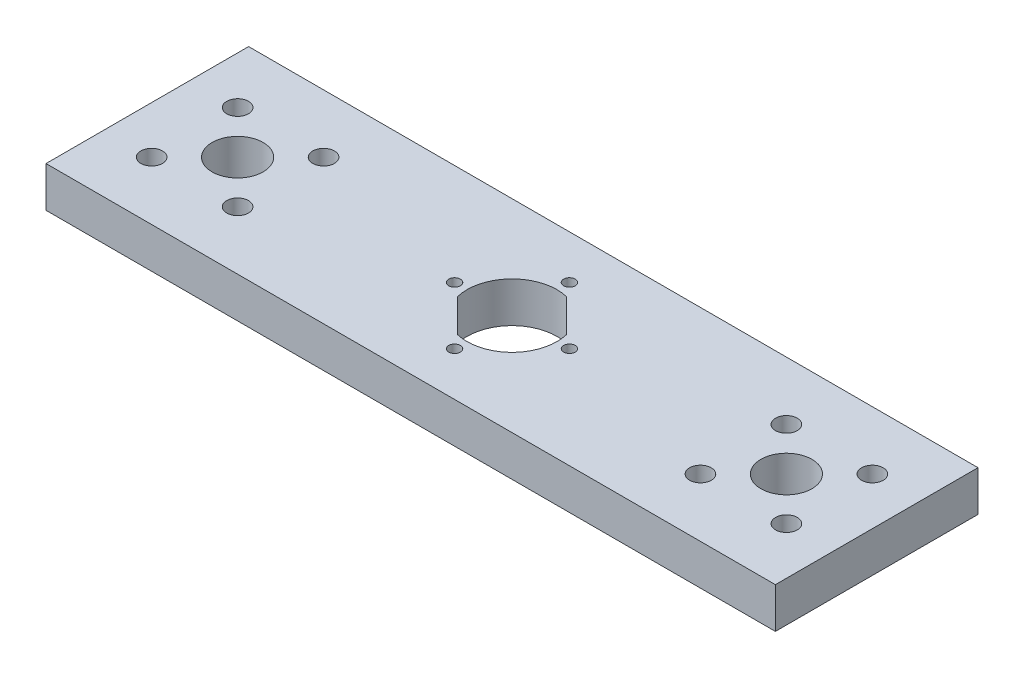
ISO-10303-21;
HEADER;
FILE_DESCRIPTION(('STEP AP214'),'2;1');
FILE_NAME('part.step','',(''),(''),'','','');
FILE_SCHEMA(('AUTOMOTIVE_DESIGN { 1 0 10303 214 1 1 1 1 }'));
ENDSEC;
DATA;
#1=APPLICATION_CONTEXT('core data for automotive mechanical design processes');
#2=APPLICATION_PROTOCOL_DEFINITION('international standard','automotive_design',2000,#1);
#3=PRODUCT_CONTEXT('',#1,'mechanical');
#4=PRODUCT('Part','Part','',(#3));
#5=PRODUCT_RELATED_PRODUCT_CATEGORY('part','',(#4));
#6=PRODUCT_DEFINITION_FORMATION('','',#4);
#7=PRODUCT_DEFINITION_CONTEXT('part definition',#1,'design');
#8=PRODUCT_DEFINITION('design','',#6,#7);
#9=PRODUCT_DEFINITION_SHAPE('','',#8);
#10=(LENGTH_UNIT() NAMED_UNIT(*) SI_UNIT(.MILLI.,.METRE.));
#11=(NAMED_UNIT(*) PLANE_ANGLE_UNIT() SI_UNIT($,.RADIAN.));
#12=(NAMED_UNIT(*) SI_UNIT($,.STERADIAN.) SOLID_ANGLE_UNIT());
#13=UNCERTAINTY_MEASURE_WITH_UNIT(LENGTH_MEASURE(1.E-05),#10,'distance_accuracy_value','');
#14=(GEOMETRIC_REPRESENTATION_CONTEXT(3) GLOBAL_UNCERTAINTY_ASSIGNED_CONTEXT((#13)) GLOBAL_UNIT_ASSIGNED_CONTEXT((#10,
#11,#12)) REPRESENTATION_CONTEXT('',''));
#15=CARTESIAN_POINT('',(0.,0.,0.));
#16=DIRECTION('',(0.,0.,1.));
#17=DIRECTION('',(1.,0.,0.));
#18=AXIS2_PLACEMENT_3D('',#15,#16,#17);
#19=CARTESIAN_POINT('',(6.65649530361137,6.35,-1.6166540362697));
#20=DIRECTION('',(0.,-1.,0.));
#21=DIRECTION('',(0.,0.,-1.));
#22=AXIS2_PLACEMENT_3D('',#19,#20,#21);
#23=CYLINDRICAL_SURFACE('',#22,0.200000000000003);
#24=CARTESIAN_POINT('',(6.65649530361137,0.,-1.6166540362697));
#25=DIRECTION('',(0.,1.,0.));
#26=DIRECTION('',(0.,0.,1.));
#27=AXIS2_PLACEMENT_3D('',#24,#25,#26);
#28=CIRCLE('',#27,0.200000000000003);
#29=CARTESIAN_POINT('',(6.85084553145407,0.,-1.66385561397103));
#30=VERTEX_POINT('',#29);
#31=CARTESIAN_POINT('',(6.79791665984869,0.,-1.75807539250701));
#32=VERTEX_POINT('',#31);
#33=EDGE_CURVE('E224',#30,#32,#28,.T.);
#34=ORIENTED_EDGE('',*,*,#33,.F.);
#35=DIRECTION('',(0.,-1.,0.));
#36=VECTOR('',#35,1.);
#37=CARTESIAN_POINT('',(6.85084553145407,6.35,-1.66385561397103));
#38=LINE('',#37,#36);
#39=CARTESIAN_POINT('',(6.85084553145407,6.35,-1.66385561397103));
#40=VERTEX_POINT('',#39);
#41=EDGE_CURVE('E11',#40,#30,#38,.T.);
#42=ORIENTED_EDGE('',*,*,#41,.F.);
#43=CARTESIAN_POINT('',(6.65649530361137,6.35,-1.6166540362697));
#44=DIRECTION('',(0.,1.,0.));
#45=DIRECTION('',(0.,0.,1.));
#46=AXIS2_PLACEMENT_3D('',#43,#44,#45);
#47=CIRCLE('',#46,0.200000000000003);
#48=CARTESIAN_POINT('',(6.79791665984869,6.35,-1.75807539250701));
#49=VERTEX_POINT('',#48);
#50=EDGE_CURVE('E424',#40,#49,#47,.T.);
#51=ORIENTED_EDGE('',*,*,#50,.T.);
#52=DIRECTION('',(0.,-1.,0.));
#53=VECTOR('',#52,1.);
#54=CARTESIAN_POINT('',(6.79791665984869,6.35,-1.75807539250701));
#55=LINE('',#54,#53);
#56=EDGE_CURVE('E62',#49,#32,#55,.T.);
#57=ORIENTED_EDGE('',*,*,#56,.T.);
#58=EDGE_LOOP('',(#34,#42,#51,#57));
#59=FACE_BOUND('',#58,.T.);
#60=ADVANCED_FACE('F43',(#59),#23,.F.);
#61=CARTESIAN_POINT('',(-7.54442081724038E-13,6.35,7.70217223333702E-13));
#62=DIRECTION('',(0.,-1.,0.));
#63=DIRECTION('',(0.,0.,-1.));
#64=AXIS2_PLACEMENT_3D('',#61,#62,#63);
#65=CYLINDRICAL_SURFACE('',#64,7.05);
#66=CARTESIAN_POINT('',(-7.54442081724038E-13,0.,7.70217223333702E-13));
#67=DIRECTION('',(0.,1.,0.));
#68=DIRECTION('',(0.,0.,1.));
#69=AXIS2_PLACEMENT_3D('',#66,#67,#68);
#70=CIRCLE('',#69,7.05);
#71=CARTESIAN_POINT('',(-1.66385561397255,0.,6.85084553145559));
#72=VERTEX_POINT('',#71);
#73=EDGE_CURVE('E226',#72,#30,#70,.T.);
#74=ORIENTED_EDGE('',*,*,#73,.F.);
#75=DIRECTION('',(0.,-1.,0.));
#76=VECTOR('',#75,1.);
#77=CARTESIAN_POINT('',(-1.66385561397255,6.35,6.85084553145559));
#78=LINE('',#77,#76);
#79=CARTESIAN_POINT('',(-1.66385561397255,6.35,6.85084553145559));
#80=VERTEX_POINT('',#79);
#81=EDGE_CURVE('E53',#80,#72,#78,.T.);
#82=ORIENTED_EDGE('',*,*,#81,.F.);
#83=CARTESIAN_POINT('',(-7.54442081724038E-13,6.35,7.70217223333702E-13));
#84=DIRECTION('',(0.,1.,0.));
#85=DIRECTION('',(0.,0.,1.));
#86=AXIS2_PLACEMENT_3D('',#83,#84,#85);
#87=CIRCLE('',#86,7.05);
#88=EDGE_CURVE('E419',#80,#40,#87,.T.);
#89=ORIENTED_EDGE('',*,*,#88,.T.);
#90=ORIENTED_EDGE('',*,*,#41,.T.);
#91=EDGE_LOOP('',(#74,#82,#89,#90));
#92=FACE_BOUND('',#91,.T.);
#93=ADVANCED_FACE('F313',(#92),#65,.F.);
#94=CARTESIAN_POINT('',(-1.61665403627122,6.35,6.6564953036129));
#95=DIRECTION('',(0.,-1.,0.));
#96=DIRECTION('',(0.,0.,-1.));
#97=AXIS2_PLACEMENT_3D('',#94,#95,#96);
#98=CYLINDRICAL_SURFACE('',#97,0.200000000000007);
#99=CARTESIAN_POINT('',(-1.61665403627122,0.,6.6564953036129));
#100=DIRECTION('',(0.,1.,0.));
#101=DIRECTION('',(0.,0.,1.));
#102=AXIS2_PLACEMENT_3D('',#99,#100,#101);
#103=CIRCLE('',#102,0.200000000000007);
#104=CARTESIAN_POINT('',(-1.75807539250853,0.,6.79791665985022));
#105=VERTEX_POINT('',#104);
#106=EDGE_CURVE('E229',#105,#72,#103,.T.);
#107=ORIENTED_EDGE('',*,*,#106,.F.);
#108=DIRECTION('',(0.,-1.,0.));
#109=VECTOR('',#108,1.);
#110=CARTESIAN_POINT('',(-1.75807539250853,6.35,6.79791665985022));
#111=LINE('',#110,#109);
#112=CARTESIAN_POINT('',(-1.75807539250853,6.35,6.79791665985022));
#113=VERTEX_POINT('',#112);
#114=EDGE_CURVE('E274',#113,#105,#111,.T.);
#115=ORIENTED_EDGE('',*,*,#114,.F.);
#116=CARTESIAN_POINT('',(-1.61665403627122,6.35,6.6564953036129));
#117=DIRECTION('',(0.,1.,0.));
#118=DIRECTION('',(0.,0.,1.));
#119=AXIS2_PLACEMENT_3D('',#116,#117,#118);
#120=CIRCLE('',#119,0.200000000000007);
#121=EDGE_CURVE('E417',#113,#80,#120,.T.);
#122=ORIENTED_EDGE('',*,*,#121,.T.);
#123=ORIENTED_EDGE('',*,*,#81,.T.);
#124=EDGE_LOOP('',(#107,#115,#122,#123));
#125=FACE_BOUND('',#124,.T.);
#126=ADVANCED_FACE('F318',(#125),#98,.F.);
#127=CARTESIAN_POINT('',(-4.27799602617938,6.35,4.27799602617938));
#128=DIRECTION('',(0.707106781186548,0.,-0.707106781186547));
#129=DIRECTION('',(-0.707106781186547,0.,-0.707106781186548));
#130=AXIS2_PLACEMENT_3D('',#127,#128,#129);
#131=PLANE('',#130);
#132=DIRECTION('',(0.707106781186547,0.,0.707106781186548));
#133=VECTOR('',#132,1.);
#134=CARTESIAN_POINT('',(-4.27799602617938,0.,4.27799602617938));
#135=LINE('',#134,#133);
#136=CARTESIAN_POINT('',(-6.7979166598502,0.,1.75807539250856));
#137=VERTEX_POINT('',#136);
#138=EDGE_CURVE('E232',#137,#105,#135,.T.);
#139=ORIENTED_EDGE('',*,*,#138,.F.);
#140=DIRECTION('',(0.,-1.,0.));
#141=VECTOR('',#140,1.);
#142=CARTESIAN_POINT('',(-6.7979166598502,6.35,1.75807539250856));
#143=LINE('',#142,#141);
#144=CARTESIAN_POINT('',(-6.7979166598502,6.35,1.75807539250856));
#145=VERTEX_POINT('',#144);
#146=EDGE_CURVE('E272',#145,#137,#143,.T.);
#147=ORIENTED_EDGE('',*,*,#146,.F.);
#148=DIRECTION('',(0.707106781186547,0.,0.707106781186548));
#149=VECTOR('',#148,1.);
#150=CARTESIAN_POINT('',(-4.27799602617938,6.35,4.27799602617938));
#151=LINE('',#150,#149);
#152=EDGE_CURVE('E416',#145,#113,#151,.T.);
#153=ORIENTED_EDGE('',*,*,#152,.T.);
#154=ORIENTED_EDGE('',*,*,#114,.T.);
#155=EDGE_LOOP('',(#139,#147,#153,#154));
#156=FACE_BOUND('',#155,.T.);
#157=ADVANCED_FACE('F399',(#156),#131,.T.);
#158=CARTESIAN_POINT('',(-6.65649530361288,6.35,1.61665403627125));
#159=DIRECTION('',(0.,-1.,0.));
#160=DIRECTION('',(0.,0.,-1.));
#161=AXIS2_PLACEMENT_3D('',#158,#159,#160);
#162=CYLINDRICAL_SURFACE('',#161,0.200000000000004);
#163=CARTESIAN_POINT('',(-6.65649530361288,0.,1.61665403627125));
#164=DIRECTION('',(0.,1.,0.));
#165=DIRECTION('',(0.,0.,1.));
#166=AXIS2_PLACEMENT_3D('',#163,#164,#165);
#167=CIRCLE('',#166,0.200000000000004);
#168=CARTESIAN_POINT('',(-6.85084553145558,0.,1.66385561397257));
#169=VERTEX_POINT('',#168);
#170=EDGE_CURVE('E235',#169,#137,#167,.T.);
#171=ORIENTED_EDGE('',*,*,#170,.F.);
#172=DIRECTION('',(0.,-1.,0.));
#173=VECTOR('',#172,1.);
#174=CARTESIAN_POINT('',(-6.85084553145558,6.35,1.66385561397257));
#175=LINE('',#174,#173);
#176=CARTESIAN_POINT('',(-6.85084553145558,6.35,1.66385561397257));
#177=VERTEX_POINT('',#176);
#178=EDGE_CURVE('E149',#177,#169,#175,.T.);
#179=ORIENTED_EDGE('',*,*,#178,.F.);
#180=CARTESIAN_POINT('',(-6.65649530361288,6.35,1.61665403627125));
#181=DIRECTION('',(0.,1.,0.));
#182=DIRECTION('',(0.,0.,1.));
#183=AXIS2_PLACEMENT_3D('',#180,#181,#182);
#184=CIRCLE('',#183,0.200000000000004);
#185=EDGE_CURVE('E161',#177,#145,#184,.T.);
#186=ORIENTED_EDGE('',*,*,#185,.T.);
#187=ORIENTED_EDGE('',*,*,#146,.T.);
#188=EDGE_LOOP('',(#171,#179,#186,#187));
#189=FACE_BOUND('',#188,.T.);
#190=ADVANCED_FACE('F396',(#189),#162,.F.);
#191=CARTESIAN_POINT('',(-7.54442081724038E-13,6.35,7.70217223333702E-13));
#192=DIRECTION('',(0.,-1.,0.));
#193=DIRECTION('',(0.,0.,-1.));
#194=AXIS2_PLACEMENT_3D('',#191,#192,#193);
#195=CYLINDRICAL_SURFACE('',#194,7.05);
#196=CARTESIAN_POINT('',(-7.54442081724038E-13,0.,7.70217223333702E-13));
#197=DIRECTION('',(0.,1.,0.));
#198=DIRECTION('',(0.,0.,1.));
#199=AXIS2_PLACEMENT_3D('',#196,#197,#198);
#200=CIRCLE('',#199,7.05);
#201=CARTESIAN_POINT('',(1.66385561397105,0.,-6.85084553145405));
#202=VERTEX_POINT('',#201);
#203=EDGE_CURVE('E145',#202,#169,#200,.T.);
#204=ORIENTED_EDGE('',*,*,#203,.F.);
#205=DIRECTION('',(0.,-1.,0.));
#206=VECTOR('',#205,1.);
#207=CARTESIAN_POINT('',(1.66385561397105,6.35,-6.85084553145405));
#208=LINE('',#207,#206);
#209=CARTESIAN_POINT('',(1.66385561397105,6.35,-6.85084553145405));
#210=VERTEX_POINT('',#209);
#211=EDGE_CURVE('E140',#210,#202,#208,.T.);
#212=ORIENTED_EDGE('',*,*,#211,.F.);
#213=CARTESIAN_POINT('',(-7.54442081724038E-13,6.35,7.70217223333702E-13));
#214=DIRECTION('',(0.,1.,0.));
#215=DIRECTION('',(0.,0.,1.));
#216=AXIS2_PLACEMENT_3D('',#213,#214,#215);
#217=CIRCLE('',#216,7.05);
#218=EDGE_CURVE('E143',#210,#177,#217,.T.);
#219=ORIENTED_EDGE('',*,*,#218,.T.);
#220=ORIENTED_EDGE('',*,*,#178,.T.);
#221=EDGE_LOOP('',(#204,#212,#219,#220));
#222=FACE_BOUND('',#221,.T.);
#223=ADVANCED_FACE('F142',(#222),#195,.F.);
#224=CARTESIAN_POINT('',(1.61665403626972,6.35,-6.65649530361136));
#225=DIRECTION('',(0.,-1.,0.));
#226=DIRECTION('',(0.,0.,-1.));
#227=AXIS2_PLACEMENT_3D('',#224,#225,#226);
#228=CYLINDRICAL_SURFACE('',#227,0.200000000000008);
#229=CARTESIAN_POINT('',(1.61665403626972,0.,-6.65649530361136));
#230=DIRECTION('',(0.,1.,0.));
#231=DIRECTION('',(0.,0.,1.));
#232=AXIS2_PLACEMENT_3D('',#229,#230,#231);
#233=CIRCLE('',#232,0.200000000000008);
#234=CARTESIAN_POINT('',(1.75807539250702,0.,-6.79791665984868));
#235=VERTEX_POINT('',#234);
#236=EDGE_CURVE('E239',#235,#202,#233,.T.);
#237=ORIENTED_EDGE('',*,*,#236,.F.);
#238=DIRECTION('',(0.,-1.,0.));
#239=VECTOR('',#238,1.);
#240=CARTESIAN_POINT('',(1.75807539250702,6.35,-6.79791665984868));
#241=LINE('',#240,#239);
#242=CARTESIAN_POINT('',(1.75807539250702,6.35,-6.79791665984868));
#243=VERTEX_POINT('',#242);
#244=EDGE_CURVE('E99',#243,#235,#241,.T.);
#245=ORIENTED_EDGE('',*,*,#244,.F.);
#246=CARTESIAN_POINT('',(1.61665403626972,6.35,-6.65649530361136));
#247=DIRECTION('',(0.,1.,0.));
#248=DIRECTION('',(0.,0.,1.));
#249=AXIS2_PLACEMENT_3D('',#246,#247,#248);
#250=CIRCLE('',#249,0.200000000000008);
#251=EDGE_CURVE('E158',#243,#210,#250,.T.);
#252=ORIENTED_EDGE('',*,*,#251,.T.);
#253=ORIENTED_EDGE('',*,*,#211,.T.);
#254=EDGE_LOOP('',(#237,#245,#252,#253));
#255=FACE_BOUND('',#254,.T.);
#256=ADVANCED_FACE('F163',(#255),#228,.F.);
#257=CARTESIAN_POINT('',(0.,6.35,15.875));
#258=DIRECTION('',(0.,0.,-1.));
#259=DIRECTION('',(-1.,0.,0.));
#260=AXIS2_PLACEMENT_3D('',#257,#258,#259);
#261=PLANE('',#260);
#262=DIRECTION('',(1.,0.,0.));
#263=VECTOR('',#262,1.);
#264=CARTESIAN_POINT('',(0.,0.,15.875));
#265=LINE('',#264,#263);
#266=CARTESIAN_POINT('',(-57.15,0.,15.875));
#267=VERTEX_POINT('',#266);
#268=CARTESIAN_POINT('',(57.15,0.,15.875));
#269=VERTEX_POINT('',#268);
#270=EDGE_CURVE('E197',#267,#269,#265,.T.);
#271=ORIENTED_EDGE('',*,*,#270,.T.);
#272=DIRECTION('',(0.,-1.,0.));
#273=VECTOR('',#272,1.);
#274=CARTESIAN_POINT('',(57.15,6.35,15.875));
#275=LINE('',#274,#273);
#276=CARTESIAN_POINT('',(57.15,6.35,15.875));
#277=VERTEX_POINT('',#276);
#278=EDGE_CURVE('E47',#277,#269,#275,.T.);
#279=ORIENTED_EDGE('',*,*,#278,.F.);
#280=DIRECTION('',(1.,0.,0.));
#281=VECTOR('',#280,1.);
#282=CARTESIAN_POINT('',(0.,6.35,15.875));
#283=LINE('',#282,#281);
#284=CARTESIAN_POINT('',(-57.15,6.35,15.875));
#285=VERTEX_POINT('',#284);
#286=EDGE_CURVE('E445',#285,#277,#283,.T.);
#287=ORIENTED_EDGE('',*,*,#286,.F.);
#288=DIRECTION('',(0.,-1.,0.));
#289=VECTOR('',#288,1.);
#290=CARTESIAN_POINT('',(-57.15,6.35,15.875));
#291=LINE('',#290,#289);
#292=EDGE_CURVE('E193',#285,#267,#291,.T.);
#293=ORIENTED_EDGE('',*,*,#292,.T.);
#294=EDGE_LOOP('',(#271,#279,#287,#293));
#295=FACE_BOUND('',#294,.T.);
#296=ADVANCED_FACE('F288',(#295),#261,.F.);
#297=CARTESIAN_POINT('',(57.15,6.35,0.));
#298=DIRECTION('',(-1.,0.,0.));
#299=DIRECTION('',(0.,0.,1.));
#300=AXIS2_PLACEMENT_3D('',#297,#298,#299);
#301=PLANE('',#300);
#302=DIRECTION('',(0.,0.,-1.));
#303=VECTOR('',#302,1.);
#304=CARTESIAN_POINT('',(57.15,0.,0.));
#305=LINE('',#304,#303);
#306=CARTESIAN_POINT('',(57.15,0.,-15.875));
#307=VERTEX_POINT('',#306);
#308=EDGE_CURVE('E200',#269,#307,#305,.T.);
#309=ORIENTED_EDGE('',*,*,#308,.T.);
#310=DIRECTION('',(0.,-1.,0.));
#311=VECTOR('',#310,1.);
#312=CARTESIAN_POINT('',(57.15,6.35,-15.875));
#313=LINE('',#312,#311);
#314=CARTESIAN_POINT('',(57.15,6.35,-15.875));
#315=VERTEX_POINT('',#314);
#316=EDGE_CURVE('E279',#315,#307,#313,.T.);
#317=ORIENTED_EDGE('',*,*,#316,.F.);
#318=DIRECTION('',(0.,0.,-1.));
#319=VECTOR('',#318,1.);
#320=CARTESIAN_POINT('',(57.15,6.35,0.));
#321=LINE('',#320,#319);
#322=EDGE_CURVE('E112',#277,#315,#321,.T.);
#323=ORIENTED_EDGE('',*,*,#322,.F.);
#324=ORIENTED_EDGE('',*,*,#278,.T.);
#325=EDGE_LOOP('',(#309,#317,#323,#324));
#326=FACE_BOUND('',#325,.T.);
#327=ADVANCED_FACE('F284',(#326),#301,.F.);
#328=CARTESIAN_POINT('',(0.,6.35,-15.875));
#329=DIRECTION('',(0.,0.,-1.));
#330=DIRECTION('',(-1.,0.,0.));
#331=AXIS2_PLACEMENT_3D('',#328,#329,#330);
#332=PLANE('',#331);
#333=DIRECTION('',(1.,0.,0.));
#334=VECTOR('',#333,1.);
#335=CARTESIAN_POINT('',(0.,0.,-15.875));
#336=LINE('',#335,#334);
#337=CARTESIAN_POINT('',(-57.15,0.,-15.875));
#338=VERTEX_POINT('',#337);
#339=EDGE_CURVE('E203',#338,#307,#336,.T.);
#340=ORIENTED_EDGE('',*,*,#339,.F.);
#341=DIRECTION('',(0.,-1.,0.));
#342=VECTOR('',#341,1.);
#343=CARTESIAN_POINT('',(-57.15,6.35,-15.875));
#344=LINE('',#343,#342);
#345=CARTESIAN_POINT('',(-57.15,6.35,-15.875));
#346=VERTEX_POINT('',#345);
#347=EDGE_CURVE('E278',#346,#338,#344,.T.);
#348=ORIENTED_EDGE('',*,*,#347,.F.);
#349=DIRECTION('',(1.,0.,0.));
#350=VECTOR('',#349,1.);
#351=CARTESIAN_POINT('',(0.,6.35,-15.875));
#352=LINE('',#351,#350);
#353=EDGE_CURVE('E442',#346,#315,#352,.T.);
#354=ORIENTED_EDGE('',*,*,#353,.T.);
#355=ORIENTED_EDGE('',*,*,#316,.T.);
#356=EDGE_LOOP('',(#340,#348,#354,#355));
#357=FACE_BOUND('',#356,.T.);
#358=ADVANCED_FACE('F299',(#357),#332,.T.);
#359=CARTESIAN_POINT('',(36.2648080151981,6.35,6.73519209080187));
#360=DIRECTION('',(0.,-1.,0.));
#361=DIRECTION('',(0.,0.,-1.));
#362=AXIS2_PLACEMENT_3D('',#359,#360,#361);
#363=CYLINDRICAL_SURFACE('',#362,1.7);
#364=CARTESIAN_POINT('',(36.2648080151981,6.35,6.73519209080187));
#365=DIRECTION('',(0.,1.,0.));
#366=DIRECTION('',(0.,0.,1.));
#367=AXIS2_PLACEMENT_3D('',#364,#365,#366);
#368=CIRCLE('',#367,1.7);
#369=CARTESIAN_POINT('',(36.2648080151981,6.35,8.43519209080187));
#370=VERTEX_POINT('',#369);
#371=EDGE_CURVE('E187',#370,#370,#368,.T.);
#372=ORIENTED_EDGE('',*,*,#371,.T.);
#373=EDGE_LOOP('',(#372));
#374=FACE_BOUND('',#373,.T.);
#375=CARTESIAN_POINT('',(36.2648080151981,0.,6.73519209080187));
#376=DIRECTION('',(0.,1.,0.));
#377=DIRECTION('',(0.,0.,1.));
#378=AXIS2_PLACEMENT_3D('',#375,#376,#377);
#379=CIRCLE('',#378,1.7);
#380=CARTESIAN_POINT('',(36.2648080151981,0.,8.43519209080187));
#381=VERTEX_POINT('',#380);
#382=EDGE_CURVE('E262',#381,#381,#379,.T.);
#383=ORIENTED_EDGE('',*,*,#382,.F.);
#384=EDGE_LOOP('',(#383));
#385=FACE_BOUND('',#384,.T.);
#386=ADVANCED_FACE('F301',(#374,#385),#363,.F.);
#387=CARTESIAN_POINT('',(9.0000001341097,6.35,7.70217223333702E-13));
#388=DIRECTION('',(0.,-1.,0.));
#389=DIRECTION('',(0.,0.,-1.));
#390=AXIS2_PLACEMENT_3D('',#387,#388,#389);
#391=CYLINDRICAL_SURFACE('',#390,0.911499999999999);
#392=CARTESIAN_POINT('',(9.0000001341097,6.35,7.70217223333702E-13));
#393=DIRECTION('',(0.,1.,0.));
#394=DIRECTION('',(0.,0.,1.));
#395=AXIS2_PLACEMENT_3D('',#392,#393,#394);
#396=CIRCLE('',#395,0.911499999999999);
#397=CARTESIAN_POINT('',(9.0000001341097,6.35,0.911500000000769));
#398=VERTEX_POINT('',#397);
#399=EDGE_CURVE('E184',#398,#398,#396,.T.);
#400=ORIENTED_EDGE('',*,*,#399,.T.);
#401=EDGE_LOOP('',(#400));
#402=FACE_BOUND('',#401,.T.);
#403=CARTESIAN_POINT('',(9.0000001341097,0.,7.70217223333702E-13));
#404=DIRECTION('',(0.,1.,0.));
#405=DIRECTION('',(0.,0.,1.));
#406=AXIS2_PLACEMENT_3D('',#403,#404,#405);
#407=CIRCLE('',#406,0.911499999999999);
#408=CARTESIAN_POINT('',(9.0000001341097,0.,0.911500000000769));
#409=VERTEX_POINT('',#408);
#410=EDGE_CURVE('E259',#409,#409,#407,.T.);
#411=ORIENTED_EDGE('',*,*,#410,.F.);
#412=EDGE_LOOP('',(#411));
#413=FACE_BOUND('',#412,.T.);
#414=ADVANCED_FACE('F307',(#402,#413),#391,.F.);
#415=CARTESIAN_POINT('',(43.000000106,6.35,0.));
#416=DIRECTION('',(0.,-1.,0.));
#417=DIRECTION('',(0.,0.,-1.));
#418=AXIS2_PLACEMENT_3D('',#415,#416,#417);
#419=CYLINDRICAL_SURFACE('',#418,4.00000000000001);
#420=CARTESIAN_POINT('',(43.000000106,6.35,0.));
#421=DIRECTION('',(0.,1.,0.));
#422=DIRECTION('',(0.,0.,1.));
#423=AXIS2_PLACEMENT_3D('',#420,#421,#422);
#424=CIRCLE('',#423,4.00000000000001);
#425=CARTESIAN_POINT('',(43.000000106,6.35,4.));
#426=VERTEX_POINT('',#425);
#427=EDGE_CURVE('E181',#426,#426,#424,.T.);
#428=ORIENTED_EDGE('',*,*,#427,.T.);
#429=EDGE_LOOP('',(#428));
#430=FACE_BOUND('',#429,.T.);
#431=CARTESIAN_POINT('',(43.000000106,0.,0.));
#432=DIRECTION('',(0.,1.,0.));
#433=DIRECTION('',(0.,0.,1.));
#434=AXIS2_PLACEMENT_3D('',#431,#432,#433);
#435=CIRCLE('',#434,4.00000000000001);
#436=CARTESIAN_POINT('',(43.000000106,0.,4.));
#437=VERTEX_POINT('',#436);
#438=EDGE_CURVE('E256',#437,#437,#435,.T.);
#439=ORIENTED_EDGE('',*,*,#438,.F.);
#440=EDGE_LOOP('',(#439));
#441=FACE_BOUND('',#440,.T.);
#442=ADVANCED_FACE('F369',(#430,#441),#419,.F.);
#443=CARTESIAN_POINT('',(49.7351921968019,6.35,6.73519209080186));
#444=DIRECTION('',(0.,-1.,0.));
#445=DIRECTION('',(0.,0.,-1.));
#446=AXIS2_PLACEMENT_3D('',#443,#444,#445);
#447=CYLINDRICAL_SURFACE('',#446,1.7);
#448=CARTESIAN_POINT('',(49.7351921968019,6.35,6.73519209080186));
#449=DIRECTION('',(0.,1.,0.));
#450=DIRECTION('',(0.,0.,1.));
#451=AXIS2_PLACEMENT_3D('',#448,#449,#450);
#452=CIRCLE('',#451,1.7);
#453=CARTESIAN_POINT('',(49.7351921968019,6.35,8.43519209080186));
#454=VERTEX_POINT('',#453);
#455=EDGE_CURVE('E178',#454,#454,#452,.F.);
#456=ORIENTED_EDGE('',*,*,#455,.F.);
#457=EDGE_LOOP('',(#456));
#458=FACE_BOUND('',#457,.T.);
#459=CARTESIAN_POINT('',(49.7351921968019,0.,6.73519209080186));
#460=DIRECTION('',(0.,1.,0.));
#461=DIRECTION('',(0.,0.,1.));
#462=AXIS2_PLACEMENT_3D('',#459,#460,#461);
#463=CIRCLE('',#462,1.7);
#464=CARTESIAN_POINT('',(49.7351921968019,0.,8.43519209080186));
#465=VERTEX_POINT('',#464);
#466=EDGE_CURVE('E253',#465,#465,#463,.F.);
#467=ORIENTED_EDGE('',*,*,#466,.T.);
#468=EDGE_LOOP('',(#467));
#469=FACE_BOUND('',#468,.T.);
#470=ADVANCED_FACE('F373',(#458,#469),#447,.F.);
#471=CARTESIAN_POINT('',(49.7351921968019,6.35,-6.73519209080186));
#472=DIRECTION('',(0.,-1.,0.));
#473=DIRECTION('',(0.,0.,-1.));
#474=AXIS2_PLACEMENT_3D('',#471,#472,#473);
#475=CYLINDRICAL_SURFACE('',#474,1.7);
#476=CARTESIAN_POINT('',(49.7351921968019,6.35,-6.73519209080186));
#477=DIRECTION('',(0.,1.,0.));
#478=DIRECTION('',(0.,0.,1.));
#479=AXIS2_PLACEMENT_3D('',#476,#477,#478);
#480=CIRCLE('',#479,1.7);
#481=CARTESIAN_POINT('',(49.7351921968019,6.35,-5.03519209080187));
#482=VERTEX_POINT('',#481);
#483=EDGE_CURVE('E175',#482,#482,#480,.T.);
#484=ORIENTED_EDGE('',*,*,#483,.T.);
#485=EDGE_LOOP('',(#484));
#486=FACE_BOUND('',#485,.T.);
#487=CARTESIAN_POINT('',(49.7351921968019,0.,-6.73519209080186));
#488=DIRECTION('',(0.,1.,0.));
#489=DIRECTION('',(0.,0.,1.));
#490=AXIS2_PLACEMENT_3D('',#487,#488,#489);
#491=CIRCLE('',#490,1.7);
#492=CARTESIAN_POINT('',(49.7351921968019,0.,-5.03519209080187));
#493=VERTEX_POINT('',#492);
#494=EDGE_CURVE('E250',#493,#493,#491,.T.);
#495=ORIENTED_EDGE('',*,*,#494,.F.);
#496=EDGE_LOOP('',(#495));
#497=FACE_BOUND('',#496,.T.);
#498=ADVANCED_FACE('F377',(#486,#497),#475,.F.);
#499=CARTESIAN_POINT('',(-36.2648080151981,6.35,6.73519209080188));
#500=DIRECTION('',(0.,-1.,0.));
#501=DIRECTION('',(0.,0.,-1.));
#502=AXIS2_PLACEMENT_3D('',#499,#500,#501);
#503=CYLINDRICAL_SURFACE('',#502,1.7);
#504=CARTESIAN_POINT('',(-36.2648080151981,6.35,6.73519209080188));
#505=DIRECTION('',(0.,1.,0.));
#506=DIRECTION('',(0.,0.,1.));
#507=AXIS2_PLACEMENT_3D('',#504,#505,#506);
#508=CIRCLE('',#507,1.7);
#509=CARTESIAN_POINT('',(-36.2648080151981,6.35,8.43519209080188));
#510=VERTEX_POINT('',#509);
#511=EDGE_CURVE('E172',#510,#510,#508,.F.);
#512=ORIENTED_EDGE('',*,*,#511,.F.);
#513=EDGE_LOOP('',(#512));
#514=FACE_BOUND('',#513,.T.);
#515=CARTESIAN_POINT('',(-36.2648080151981,0.,6.73519209080188));
#516=DIRECTION('',(0.,1.,0.));
#517=DIRECTION('',(0.,0.,1.));
#518=AXIS2_PLACEMENT_3D('',#515,#516,#517);
#519=CIRCLE('',#518,1.7);
#520=CARTESIAN_POINT('',(-36.2648080151981,0.,8.43519209080188));
#521=VERTEX_POINT('',#520);
#522=EDGE_CURVE('E247',#521,#521,#519,.F.);
#523=ORIENTED_EDGE('',*,*,#522,.T.);
#524=EDGE_LOOP('',(#523));
#525=FACE_BOUND('',#524,.T.);
#526=ADVANCED_FACE('F381',(#514,#525),#503,.F.);
#527=CARTESIAN_POINT('',(-9.0000001341112,6.35,7.70217223333702E-13));
#528=DIRECTION('',(0.,-1.,0.));
#529=DIRECTION('',(0.,0.,-1.));
#530=AXIS2_PLACEMENT_3D('',#527,#528,#529);
#531=CYLINDRICAL_SURFACE('',#530,0.911499999999999);
#532=CARTESIAN_POINT('',(-9.0000001341112,6.35,7.70217223333702E-13));
#533=DIRECTION('',(0.,1.,0.));
#534=DIRECTION('',(0.,0.,1.));
#535=AXIS2_PLACEMENT_3D('',#532,#533,#534);
#536=CIRCLE('',#535,0.911499999999999);
#537=CARTESIAN_POINT('',(-9.0000001341112,6.35,0.911500000000769));
#538=VERTEX_POINT('',#537);
#539=EDGE_CURVE('E166',#538,#538,#536,.T.);
#540=ORIENTED_EDGE('',*,*,#539,.T.);
#541=EDGE_LOOP('',(#540));
#542=FACE_BOUND('',#541,.T.);
#543=CARTESIAN_POINT('',(-9.0000001341112,0.,7.70217223333702E-13));
#544=DIRECTION('',(0.,1.,0.));
#545=DIRECTION('',(0.,0.,1.));
#546=AXIS2_PLACEMENT_3D('',#543,#544,#545);
#547=CIRCLE('',#546,0.911499999999999);
#548=CARTESIAN_POINT('',(-9.0000001341112,0.,0.911500000000769));
#549=VERTEX_POINT('',#548);
#550=EDGE_CURVE('E244',#549,#549,#547,.T.);
#551=ORIENTED_EDGE('',*,*,#550,.F.);
#552=EDGE_LOOP('',(#551));
#553=FACE_BOUND('',#552,.T.);
#554=ADVANCED_FACE('F385',(#542,#553),#531,.F.);
#555=CARTESIAN_POINT('',(4.27799602617785,6.35,-4.27799602617785));
#556=DIRECTION('',(-0.707106781186548,0.,0.707106781186547));
#557=DIRECTION('',(0.707106781186547,0.,0.707106781186548));
#558=AXIS2_PLACEMENT_3D('',#555,#556,#557);
#559=PLANE('',#558);
#560=DIRECTION('',(-0.707106781186547,0.,-0.707106781186548));
#561=VECTOR('',#560,1.);
#562=CARTESIAN_POINT('',(4.27799602617785,0.,-4.27799602617785));
#563=LINE('',#562,#561);
#564=EDGE_CURVE('E241',#32,#235,#563,.T.);
#565=ORIENTED_EDGE('',*,*,#564,.F.);
#566=ORIENTED_EDGE('',*,*,#56,.F.);
#567=DIRECTION('',(-0.707106781186547,0.,-0.707106781186548));
#568=VECTOR('',#567,1.);
#569=CARTESIAN_POINT('',(4.27799602617785,6.35,-4.27799602617785));
#570=LINE('',#569,#568);
#571=EDGE_CURVE('E164',#49,#243,#570,.T.);
#572=ORIENTED_EDGE('',*,*,#571,.T.);
#573=ORIENTED_EDGE('',*,*,#244,.T.);
#574=EDGE_LOOP('',(#565,#566,#572,#573));
#575=FACE_BOUND('',#574,.T.);
#576=ADVANCED_FACE('F327',(#575),#559,.T.);
#577=CARTESIAN_POINT('',(-43.000000106,6.35,0.));
#578=DIRECTION('',(0.,-1.,0.));
#579=DIRECTION('',(0.,0.,-1.));
#580=AXIS2_PLACEMENT_3D('',#577,#578,#579);
#581=CYLINDRICAL_SURFACE('',#580,4.00000000000001);
#582=CARTESIAN_POINT('',(-43.000000106,6.35,0.));
#583=DIRECTION('',(0.,1.,0.));
#584=DIRECTION('',(0.,0.,1.));
#585=AXIS2_PLACEMENT_3D('',#582,#583,#584);
#586=CIRCLE('',#585,4.00000000000001);
#587=CARTESIAN_POINT('',(-43.000000106,6.35,4.00000000000001));
#588=VERTEX_POINT('',#587);
#589=EDGE_CURVE('E426',#588,#588,#586,.T.);
#590=ORIENTED_EDGE('',*,*,#589,.T.);
#591=EDGE_LOOP('',(#590));
#592=FACE_BOUND('',#591,.T.);
#593=CARTESIAN_POINT('',(-43.000000106,0.,0.));
#594=DIRECTION('',(0.,1.,0.));
#595=DIRECTION('',(0.,0.,1.));
#596=AXIS2_PLACEMENT_3D('',#593,#594,#595);
#597=CIRCLE('',#596,4.00000000000001);
#598=CARTESIAN_POINT('',(-43.000000106,0.,4.00000000000001));
#599=VERTEX_POINT('',#598);
#600=EDGE_CURVE('E221',#599,#599,#597,.T.);
#601=ORIENTED_EDGE('',*,*,#600,.F.);
#602=EDGE_LOOP('',(#601));
#603=FACE_BOUND('',#602,.T.);
#604=ADVANCED_FACE('F323',(#592,#603),#581,.F.);
#605=CARTESIAN_POINT('',(-36.2648080151981,6.35,-6.73519209080188));
#606=DIRECTION('',(0.,-1.,0.));
#607=DIRECTION('',(0.,0.,-1.));
#608=AXIS2_PLACEMENT_3D('',#605,#606,#607);
#609=CYLINDRICAL_SURFACE('',#608,1.7);
#610=CARTESIAN_POINT('',(-36.2648080151981,6.35,-6.73519209080188));
#611=DIRECTION('',(0.,1.,0.));
#612=DIRECTION('',(0.,0.,1.));
#613=AXIS2_PLACEMENT_3D('',#610,#611,#612);
#614=CIRCLE('',#613,1.7);
#615=CARTESIAN_POINT('',(-36.2648080151981,6.35,-5.03519209080188));
#616=VERTEX_POINT('',#615);
#617=EDGE_CURVE('E429',#616,#616,#614,.T.);
#618=ORIENTED_EDGE('',*,*,#617,.T.);
#619=EDGE_LOOP('',(#618));
#620=FACE_BOUND('',#619,.T.);
#621=CARTESIAN_POINT('',(-36.2648080151981,0.,-6.73519209080188));
#622=DIRECTION('',(0.,1.,0.));
#623=DIRECTION('',(0.,0.,1.));
#624=AXIS2_PLACEMENT_3D('',#621,#622,#623);
#625=CIRCLE('',#624,1.7);
#626=CARTESIAN_POINT('',(-36.2648080151981,0.,-5.03519209080188));
#627=VERTEX_POINT('',#626);
#628=EDGE_CURVE('E218',#627,#627,#625,.T.);
#629=ORIENTED_EDGE('',*,*,#628,.F.);
#630=EDGE_LOOP('',(#629));
#631=FACE_BOUND('',#630,.T.);
#632=ADVANCED_FACE('F326',(#620,#631),#609,.F.);
#633=CARTESIAN_POINT('',(-49.7351921968019,6.35,-6.73519209080188));
#634=DIRECTION('',(0.,-1.,0.));
#635=DIRECTION('',(0.,0.,-1.));
#636=AXIS2_PLACEMENT_3D('',#633,#634,#635);
#637=CYLINDRICAL_SURFACE('',#636,1.7);
#638=CARTESIAN_POINT('',(-49.7351921968019,6.35,-6.73519209080188));
#639=DIRECTION('',(0.,1.,0.));
#640=DIRECTION('',(0.,0.,1.));
#641=AXIS2_PLACEMENT_3D('',#638,#639,#640);
#642=CIRCLE('',#641,1.7);
#643=CARTESIAN_POINT('',(-49.7351921968019,6.35,-5.03519209080188));
#644=VERTEX_POINT('',#643);
#645=EDGE_CURVE('E432',#644,#644,#642,.F.);
#646=ORIENTED_EDGE('',*,*,#645,.F.);
#647=EDGE_LOOP('',(#646));
#648=FACE_BOUND('',#647,.T.);
#649=CARTESIAN_POINT('',(-49.7351921968019,0.,-6.73519209080188));
#650=DIRECTION('',(0.,1.,0.));
#651=DIRECTION('',(0.,0.,1.));
#652=AXIS2_PLACEMENT_3D('',#649,#650,#651);
#653=CIRCLE('',#652,1.7);
#654=CARTESIAN_POINT('',(-49.7351921968019,0.,-5.03519209080188));
#655=VERTEX_POINT('',#654);
#656=EDGE_CURVE('E215',#655,#655,#653,.F.);
#657=ORIENTED_EDGE('',*,*,#656,.T.);
#658=EDGE_LOOP('',(#657));
#659=FACE_BOUND('',#658,.T.);
#660=ADVANCED_FACE('F331',(#648,#659),#637,.F.);
#661=CARTESIAN_POINT('',(-49.7351921968019,6.35,6.73519209080188));
#662=DIRECTION('',(0.,-1.,0.));
#663=DIRECTION('',(0.,0.,-1.));
#664=AXIS2_PLACEMENT_3D('',#661,#662,#663);
#665=CYLINDRICAL_SURFACE('',#664,1.7);
#666=CARTESIAN_POINT('',(-49.7351921968019,6.35,6.73519209080188));
#667=DIRECTION('',(0.,1.,0.));
#668=DIRECTION('',(0.,0.,1.));
#669=AXIS2_PLACEMENT_3D('',#666,#667,#668);
#670=CIRCLE('',#669,1.7);
#671=CARTESIAN_POINT('',(-49.7351921968019,6.35,8.43519209080188));
#672=VERTEX_POINT('',#671);
#673=EDGE_CURVE('E435',#672,#672,#670,.T.);
#674=ORIENTED_EDGE('',*,*,#673,.T.);
#675=EDGE_LOOP('',(#674));
#676=FACE_BOUND('',#675,.T.);
#677=CARTESIAN_POINT('',(-49.7351921968019,0.,6.73519209080188));
#678=DIRECTION('',(0.,1.,0.));
#679=DIRECTION('',(0.,0.,1.));
#680=AXIS2_PLACEMENT_3D('',#677,#678,#679);
#681=CIRCLE('',#680,1.7);
#682=CARTESIAN_POINT('',(-49.7351921968019,0.,8.43519209080188));
#683=VERTEX_POINT('',#682);
#684=EDGE_CURVE('E212',#683,#683,#681,.T.);
#685=ORIENTED_EDGE('',*,*,#684,.F.);
#686=EDGE_LOOP('',(#685));
#687=FACE_BOUND('',#686,.T.);
#688=ADVANCED_FACE('F335',(#676,#687),#665,.F.);
#689=CARTESIAN_POINT('',(-7.52237717452725E-13,6.35,9.00000013411123));
#690=DIRECTION('',(0.,-1.,0.));
#691=DIRECTION('',(0.,0.,-1.));
#692=AXIS2_PLACEMENT_3D('',#689,#690,#691);
#693=CYLINDRICAL_SURFACE('',#692,0.911499999999999);
#694=CARTESIAN_POINT('',(-7.52237717452725E-13,6.35,9.00000013411123));
#695=DIRECTION('',(0.,1.,0.));
#696=DIRECTION('',(0.,0.,1.));
#697=AXIS2_PLACEMENT_3D('',#694,#695,#696);
#698=CIRCLE('',#697,0.911499999999999);
#699=CARTESIAN_POINT('',(-7.52237717452725E-13,6.35,9.91150013411123));
#700=VERTEX_POINT('',#699);
#701=EDGE_CURVE('E438',#700,#700,#698,.T.);
#702=ORIENTED_EDGE('',*,*,#701,.T.);
#703=EDGE_LOOP('',(#702));
#704=FACE_BOUND('',#703,.T.);
#705=CARTESIAN_POINT('',(-7.52237717452725E-13,0.,9.00000013411123));
#706=DIRECTION('',(0.,1.,0.));
#707=DIRECTION('',(0.,0.,1.));
#708=AXIS2_PLACEMENT_3D('',#705,#706,#707);
#709=CIRCLE('',#708,0.911499999999999);
#710=CARTESIAN_POINT('',(-7.52237717452725E-13,0.,9.91150013411123));
#711=VERTEX_POINT('',#710);
#712=EDGE_CURVE('E209',#711,#711,#709,.T.);
#713=ORIENTED_EDGE('',*,*,#712,.F.);
#714=EDGE_LOOP('',(#713));
#715=FACE_BOUND('',#714,.T.);
#716=ADVANCED_FACE('F339',(#704,#715),#693,.F.);
#717=CARTESIAN_POINT('',(-57.15,6.35,0.));
#718=DIRECTION('',(-1.,0.,0.));
#719=DIRECTION('',(0.,0.,1.));
#720=AXIS2_PLACEMENT_3D('',#717,#718,#719);
#721=PLANE('',#720);
#722=DIRECTION('',(0.,0.,-1.));
#723=VECTOR('',#722,1.);
#724=CARTESIAN_POINT('',(-57.15,0.,0.));
#725=LINE('',#724,#723);
#726=EDGE_CURVE('E206',#267,#338,#725,.T.);
#727=ORIENTED_EDGE('',*,*,#726,.F.);
#728=ORIENTED_EDGE('',*,*,#292,.F.);
#729=DIRECTION('',(0.,0.,-1.));
#730=VECTOR('',#729,1.);
#731=CARTESIAN_POINT('',(-57.15,6.35,0.));
#732=LINE('',#731,#730);
#733=EDGE_CURVE('E297',#285,#346,#732,.T.);
#734=ORIENTED_EDGE('',*,*,#733,.T.);
#735=ORIENTED_EDGE('',*,*,#347,.T.);
#736=EDGE_LOOP('',(#727,#728,#734,#735));
#737=FACE_BOUND('',#736,.T.);
#738=ADVANCED_FACE('F294',(#737),#721,.T.);
#739=CARTESIAN_POINT('',(-7.54442081724038E-13,6.35,-9.00000013410967));
#740=DIRECTION('',(0.,-1.,0.));
#741=DIRECTION('',(0.,0.,-1.));
#742=AXIS2_PLACEMENT_3D('',#739,#740,#741);
#743=CYLINDRICAL_SURFACE('',#742,0.911500000000002);
#744=CARTESIAN_POINT('',(-7.54442081724038E-13,6.35,-9.00000013410967));
#745=DIRECTION('',(0.,1.,0.));
#746=DIRECTION('',(0.,0.,1.));
#747=AXIS2_PLACEMENT_3D('',#744,#745,#746);
#748=CIRCLE('',#747,0.911500000000002);
#749=CARTESIAN_POINT('',(-7.54442081724038E-13,6.35,-8.08850013410967));
#750=VERTEX_POINT('',#749);
#751=EDGE_CURVE('E268',#750,#750,#748,.T.);
#752=ORIENTED_EDGE('',*,*,#751,.T.);
#753=EDGE_LOOP('',(#752));
#754=FACE_BOUND('',#753,.T.);
#755=CARTESIAN_POINT('',(-7.54442081724038E-13,0.,-9.00000013410967));
#756=DIRECTION('',(0.,1.,0.));
#757=DIRECTION('',(0.,0.,1.));
#758=AXIS2_PLACEMENT_3D('',#755,#756,#757);
#759=CIRCLE('',#758,0.911500000000002);
#760=CARTESIAN_POINT('',(-7.54442081724038E-13,0.,-8.08850013410967));
#761=VERTEX_POINT('',#760);
#762=EDGE_CURVE('E194',#761,#761,#759,.T.);
#763=ORIENTED_EDGE('',*,*,#762,.F.);
#764=EDGE_LOOP('',(#763));
#765=FACE_BOUND('',#764,.T.);
#766=ADVANCED_FACE('F45',(#754,#765),#743,.F.);
#767=CARTESIAN_POINT('',(36.2648080151981,6.35,-6.73519209080187));
#768=DIRECTION('',(0.,-1.,0.));
#769=DIRECTION('',(0.,0.,-1.));
#770=AXIS2_PLACEMENT_3D('',#767,#768,#769);
#771=CYLINDRICAL_SURFACE('',#770,1.7);
#772=CARTESIAN_POINT('',(36.2648080151981,6.35,-6.73519209080187));
#773=DIRECTION('',(0.,1.,0.));
#774=DIRECTION('',(0.,0.,1.));
#775=AXIS2_PLACEMENT_3D('',#772,#773,#774);
#776=CIRCLE('',#775,1.7);
#777=CARTESIAN_POINT('',(36.2648080151981,6.35,-5.03519209080187));
#778=VERTEX_POINT('',#777);
#779=EDGE_CURVE('E190',#778,#778,#776,.F.);
#780=ORIENTED_EDGE('',*,*,#779,.F.);
#781=EDGE_LOOP('',(#780));
#782=FACE_BOUND('',#781,.T.);
#783=CARTESIAN_POINT('',(36.2648080151981,0.,-6.73519209080187));
#784=DIRECTION('',(0.,1.,0.));
#785=DIRECTION('',(0.,0.,1.));
#786=AXIS2_PLACEMENT_3D('',#783,#784,#785);
#787=CIRCLE('',#786,1.7);
#788=CARTESIAN_POINT('',(36.2648080151981,0.,-5.03519209080187));
#789=VERTEX_POINT('',#788);
#790=EDGE_CURVE('E265',#789,#789,#787,.F.);
#791=ORIENTED_EDGE('',*,*,#790,.T.);
#792=EDGE_LOOP('',(#791));
#793=FACE_BOUND('',#792,.T.);
#794=ADVANCED_FACE('F347',(#782,#793),#771,.F.);
#795=CARTESIAN_POINT('',(0.,6.35,0.));
#796=DIRECTION('',(0.,1.,0.));
#797=DIRECTION('',(0.,0.,1.));
#798=AXIS2_PLACEMENT_3D('',#795,#796,#797);
#799=PLANE('',#798);
#800=ORIENTED_EDGE('',*,*,#751,.F.);
#801=EDGE_LOOP('',(#800));
#802=FACE_BOUND('',#801,.T.);
#803=ORIENTED_EDGE('',*,*,#286,.T.);
#804=ORIENTED_EDGE('',*,*,#322,.T.);
#805=ORIENTED_EDGE('',*,*,#353,.F.);
#806=ORIENTED_EDGE('',*,*,#733,.F.);
#807=EDGE_LOOP('',(#803,#804,#805,#806));
#808=FACE_BOUND('',#807,.T.);
#809=ORIENTED_EDGE('',*,*,#701,.F.);
#810=EDGE_LOOP('',(#809));
#811=FACE_BOUND('',#810,.T.);
#812=ORIENTED_EDGE('',*,*,#673,.F.);
#813=EDGE_LOOP('',(#812));
#814=FACE_BOUND('',#813,.T.);
#815=ORIENTED_EDGE('',*,*,#645,.T.);
#816=EDGE_LOOP('',(#815));
#817=FACE_BOUND('',#816,.T.);
#818=ORIENTED_EDGE('',*,*,#617,.F.);
#819=EDGE_LOOP('',(#818));
#820=FACE_BOUND('',#819,.T.);
#821=ORIENTED_EDGE('',*,*,#589,.F.);
#822=EDGE_LOOP('',(#821));
#823=FACE_BOUND('',#822,.T.);
#824=ORIENTED_EDGE('',*,*,#50,.F.);
#825=ORIENTED_EDGE('',*,*,#88,.F.);
#826=ORIENTED_EDGE('',*,*,#121,.F.);
#827=ORIENTED_EDGE('',*,*,#152,.F.);
#828=ORIENTED_EDGE('',*,*,#185,.F.);
#829=ORIENTED_EDGE('',*,*,#218,.F.);
#830=ORIENTED_EDGE('',*,*,#251,.F.);
#831=ORIENTED_EDGE('',*,*,#571,.F.);
#832=EDGE_LOOP('',(#824,#825,#826,#827,#828,#829,#830,#831));
#833=FACE_BOUND('',#832,.T.);
#834=ORIENTED_EDGE('',*,*,#539,.F.);
#835=EDGE_LOOP('',(#834));
#836=FACE_BOUND('',#835,.T.);
#837=ORIENTED_EDGE('',*,*,#511,.T.);
#838=EDGE_LOOP('',(#837));
#839=FACE_BOUND('',#838,.T.);
#840=ORIENTED_EDGE('',*,*,#483,.F.);
#841=EDGE_LOOP('',(#840));
#842=FACE_BOUND('',#841,.T.);
#843=ORIENTED_EDGE('',*,*,#455,.T.);
#844=EDGE_LOOP('',(#843));
#845=FACE_BOUND('',#844,.T.);
#846=ORIENTED_EDGE('',*,*,#427,.F.);
#847=EDGE_LOOP('',(#846));
#848=FACE_BOUND('',#847,.T.);
#849=ORIENTED_EDGE('',*,*,#399,.F.);
#850=EDGE_LOOP('',(#849));
#851=FACE_BOUND('',#850,.T.);
#852=ORIENTED_EDGE('',*,*,#371,.F.);
#853=EDGE_LOOP('',(#852));
#854=FACE_BOUND('',#853,.T.);
#855=ORIENTED_EDGE('',*,*,#779,.T.);
#856=EDGE_LOOP('',(#855));
#857=FACE_BOUND('',#856,.T.);
#858=ADVANCED_FACE('F155',(#802,#808,#811,#814,#817,#820,#823,#833,#836,#839,#842,#845,#848,
#851,#854,#857),#799,.T.);
#859=CARTESIAN_POINT('',(0.,0.,0.));
#860=DIRECTION('',(0.,1.,0.));
#861=DIRECTION('',(0.,0.,1.));
#862=AXIS2_PLACEMENT_3D('',#859,#860,#861);
#863=PLANE('',#862);
#864=ORIENTED_EDGE('',*,*,#762,.T.);
#865=EDGE_LOOP('',(#864));
#866=FACE_BOUND('',#865,.T.);
#867=ORIENTED_EDGE('',*,*,#270,.F.);
#868=ORIENTED_EDGE('',*,*,#726,.T.);
#869=ORIENTED_EDGE('',*,*,#339,.T.);
#870=ORIENTED_EDGE('',*,*,#308,.F.);
#871=EDGE_LOOP('',(#867,#868,#869,#870));
#872=FACE_BOUND('',#871,.T.);
#873=ORIENTED_EDGE('',*,*,#712,.T.);
#874=EDGE_LOOP('',(#873));
#875=FACE_BOUND('',#874,.T.);
#876=ORIENTED_EDGE('',*,*,#684,.T.);
#877=EDGE_LOOP('',(#876));
#878=FACE_BOUND('',#877,.T.);
#879=ORIENTED_EDGE('',*,*,#656,.F.);
#880=EDGE_LOOP('',(#879));
#881=FACE_BOUND('',#880,.T.);
#882=ORIENTED_EDGE('',*,*,#628,.T.);
#883=EDGE_LOOP('',(#882));
#884=FACE_BOUND('',#883,.T.);
#885=ORIENTED_EDGE('',*,*,#600,.T.);
#886=EDGE_LOOP('',(#885));
#887=FACE_BOUND('',#886,.T.);
#888=ORIENTED_EDGE('',*,*,#33,.T.);
#889=ORIENTED_EDGE('',*,*,#564,.T.);
#890=ORIENTED_EDGE('',*,*,#236,.T.);
#891=ORIENTED_EDGE('',*,*,#203,.T.);
#892=ORIENTED_EDGE('',*,*,#170,.T.);
#893=ORIENTED_EDGE('',*,*,#138,.T.);
#894=ORIENTED_EDGE('',*,*,#106,.T.);
#895=ORIENTED_EDGE('',*,*,#73,.T.);
#896=EDGE_LOOP('',(#888,#889,#890,#891,#892,#893,#894,#895));
#897=FACE_BOUND('',#896,.T.);
#898=ORIENTED_EDGE('',*,*,#550,.T.);
#899=EDGE_LOOP('',(#898));
#900=FACE_BOUND('',#899,.T.);
#901=ORIENTED_EDGE('',*,*,#522,.F.);
#902=EDGE_LOOP('',(#901));
#903=FACE_BOUND('',#902,.T.);
#904=ORIENTED_EDGE('',*,*,#494,.T.);
#905=EDGE_LOOP('',(#904));
#906=FACE_BOUND('',#905,.T.);
#907=ORIENTED_EDGE('',*,*,#466,.F.);
#908=EDGE_LOOP('',(#907));
#909=FACE_BOUND('',#908,.T.);
#910=ORIENTED_EDGE('',*,*,#438,.T.);
#911=EDGE_LOOP('',(#910));
#912=FACE_BOUND('',#911,.T.);
#913=ORIENTED_EDGE('',*,*,#410,.T.);
#914=EDGE_LOOP('',(#913));
#915=FACE_BOUND('',#914,.T.);
#916=ORIENTED_EDGE('',*,*,#382,.T.);
#917=EDGE_LOOP('',(#916));
#918=FACE_BOUND('',#917,.T.);
#919=ORIENTED_EDGE('',*,*,#790,.F.);
#920=EDGE_LOOP('',(#919));
#921=FACE_BOUND('',#920,.T.);
#922=ADVANCED_FACE('F291',(#866,#872,#875,#878,#881,#884,#887,#897,#900,#903,#906,#909,#912,
#915,#918,#921),#863,.F.);
#923=CLOSED_SHELL('',(#60,#93,#126,#157,#190,#223,#256,#296,#327,#358,#386,#414,#442,#470,#498,
#526,#554,#576,#604,#632,#660,#688,#716,#738,#766,#794,#858,#922));
#924=MANIFOLD_SOLID_BREP('B2',#923);
#925=ADVANCED_BREP_SHAPE_REPRESENTATION('',(#18,#924),#14);
#926=SHAPE_DEFINITION_REPRESENTATION(#9,#925);
ENDSEC;
END-ISO-10303-21;
